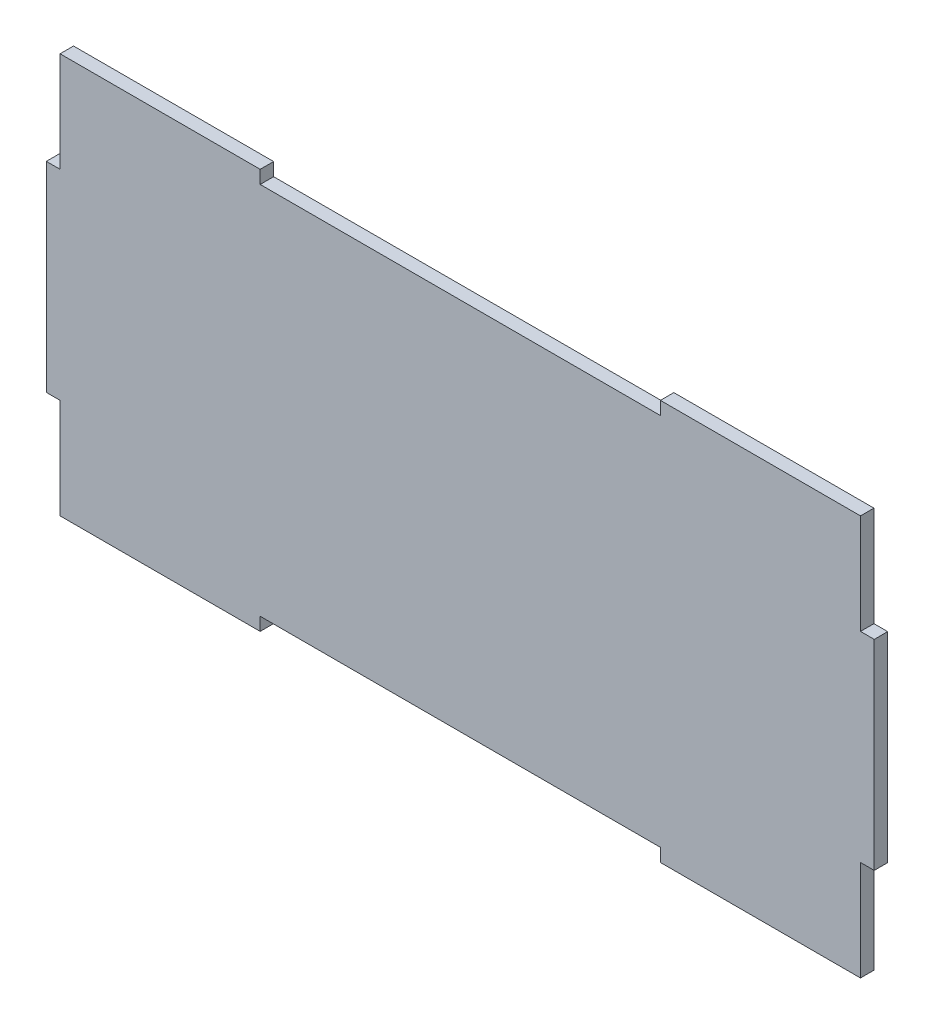
ISO-10303-21;
HEADER;
FILE_DESCRIPTION(('STEP AP214'),'2;1');
FILE_NAME('part.step','',(''),(''),'','','');
FILE_SCHEMA(('AUTOMOTIVE_DESIGN { 1 0 10303 214 1 1 1 1 }'));
ENDSEC;
DATA;
#1=APPLICATION_CONTEXT('core data for automotive mechanical design processes');
#2=APPLICATION_PROTOCOL_DEFINITION('international standard','automotive_design',2000,#1);
#3=PRODUCT_CONTEXT('',#1,'mechanical');
#4=PRODUCT('Part','Part','',(#3));
#5=PRODUCT_RELATED_PRODUCT_CATEGORY('part','',(#4));
#6=PRODUCT_DEFINITION_FORMATION('','',#4);
#7=PRODUCT_DEFINITION_CONTEXT('part definition',#1,'design');
#8=PRODUCT_DEFINITION('design','',#6,#7);
#9=PRODUCT_DEFINITION_SHAPE('','',#8);
#10=(LENGTH_UNIT() NAMED_UNIT(*) SI_UNIT(.MILLI.,.METRE.));
#11=(NAMED_UNIT(*) PLANE_ANGLE_UNIT() SI_UNIT($,.RADIAN.));
#12=(NAMED_UNIT(*) SI_UNIT($,.STERADIAN.) SOLID_ANGLE_UNIT());
#13=UNCERTAINTY_MEASURE_WITH_UNIT(LENGTH_MEASURE(1.E-05),#10,'distance_accuracy_value','');
#14=(GEOMETRIC_REPRESENTATION_CONTEXT(3) GLOBAL_UNCERTAINTY_ASSIGNED_CONTEXT((#13)) GLOBAL_UNIT_ASSIGNED_CONTEXT((#10,
#11,#12)) REPRESENTATION_CONTEXT('',''));
#15=CARTESIAN_POINT('',(0.,0.,0.));
#16=DIRECTION('',(0.,0.,1.));
#17=DIRECTION('',(1.,0.,0.));
#18=AXIS2_PLACEMENT_3D('',#15,#16,#17);
#19=CARTESIAN_POINT('',(-100.,-50.,3.36));
#20=DIRECTION('',(0.,1.,0.));
#21=DIRECTION('',(0.,0.,1.));
#22=AXIS2_PLACEMENT_3D('',#19,#20,#21);
#23=PLANE('',#22);
#24=DIRECTION('',(0.,0.,1.));
#25=VECTOR('',#24,1.);
#26=CARTESIAN_POINT('',(-50.,-50.,0.));
#27=LINE('',#26,#25);
#28=CARTESIAN_POINT('',(-50.,-50.,0.));
#29=VERTEX_POINT('',#28);
#30=CARTESIAN_POINT('',(-50.,-50.,3.36));
#31=VERTEX_POINT('',#30);
#32=EDGE_CURVE('E175',#29,#31,#27,.T.);
#33=ORIENTED_EDGE('',*,*,#32,.T.);
#34=DIRECTION('',(1.,0.,0.));
#35=VECTOR('',#34,1.);
#36=CARTESIAN_POINT('',(-100.,-50.,3.36));
#37=LINE('',#36,#35);
#38=CARTESIAN_POINT('',(-100.,-50.,3.36));
#39=VERTEX_POINT('',#38);
#40=EDGE_CURVE('E221',#39,#31,#37,.T.);
#41=ORIENTED_EDGE('',*,*,#40,.F.);
#42=DIRECTION('',(0.,0.,-1.));
#43=VECTOR('',#42,1.);
#44=CARTESIAN_POINT('',(-100.,-50.,3.36));
#45=LINE('',#44,#43);
#46=CARTESIAN_POINT('',(-100.,-50.,0.));
#47=VERTEX_POINT('',#46);
#48=EDGE_CURVE('E204',#39,#47,#45,.T.);
#49=ORIENTED_EDGE('',*,*,#48,.T.);
#50=DIRECTION('',(1.,0.,0.));
#51=VECTOR('',#50,1.);
#52=CARTESIAN_POINT('',(-100.,-50.,0.));
#53=LINE('',#52,#51);
#54=EDGE_CURVE('E196',#47,#29,#53,.T.);
#55=ORIENTED_EDGE('',*,*,#54,.T.);
#56=EDGE_LOOP('',(#33,#41,#49,#55));
#57=FACE_BOUND('',#56,.T.);
#58=ADVANCED_FACE('F38',(#57),#23,.F.);
#59=DIRECTION('',(0.,0.,1.));
#60=VECTOR('',#59,1.);
#61=CARTESIAN_POINT('',(50.,-50.,0.));
#62=LINE('',#61,#60);
#63=CARTESIAN_POINT('',(50.,-50.,0.));
#64=VERTEX_POINT('',#63);
#65=CARTESIAN_POINT('',(50.,-50.,3.36));
#66=VERTEX_POINT('',#65);
#67=EDGE_CURVE('E188',#64,#66,#62,.T.);
#68=ORIENTED_EDGE('',*,*,#67,.F.);
#69=CARTESIAN_POINT('',(100.,-50.,0.));
#70=VERTEX_POINT('',#69);
#71=EDGE_CURVE('E207',#64,#70,#53,.T.);
#72=ORIENTED_EDGE('',*,*,#71,.T.);
#73=DIRECTION('',(0.,0.,-1.));
#74=VECTOR('',#73,1.);
#75=CARTESIAN_POINT('',(100.,-50.,3.36));
#76=LINE('',#75,#74);
#77=CARTESIAN_POINT('',(100.,-50.,3.36));
#78=VERTEX_POINT('',#77);
#79=EDGE_CURVE('E217',#78,#70,#76,.T.);
#80=ORIENTED_EDGE('',*,*,#79,.F.);
#81=EDGE_CURVE('E263',#66,#78,#37,.T.);
#82=ORIENTED_EDGE('',*,*,#81,.F.);
#83=EDGE_LOOP('',(#68,#72,#80,#82));
#84=FACE_BOUND('',#83,.T.);
#85=ADVANCED_FACE('F396',(#84),#23,.F.);
#86=CARTESIAN_POINT('',(0.,0.,3.36));
#87=DIRECTION('',(0.,0.,1.));
#88=DIRECTION('',(1.,0.,0.));
#89=AXIS2_PLACEMENT_3D('',#86,#87,#88);
#90=PLANE('',#89);
#91=ORIENTED_EDGE('',*,*,#40,.T.);
#92=DIRECTION('',(0.,1.,0.));
#93=VECTOR('',#92,1.);
#94=CARTESIAN_POINT('',(-50.,-50.,3.36));
#95=LINE('',#94,#93);
#96=CARTESIAN_POINT('',(-50.,-46.72,3.36));
#97=VERTEX_POINT('',#96);
#98=EDGE_CURVE('E182',#31,#97,#95,.T.);
#99=ORIENTED_EDGE('',*,*,#98,.T.);
#100=DIRECTION('',(1.,0.,0.));
#101=VECTOR('',#100,1.);
#102=CARTESIAN_POINT('',(-50.,-46.72,3.36));
#103=LINE('',#102,#101);
#104=CARTESIAN_POINT('',(50.,-46.72,3.36));
#105=VERTEX_POINT('',#104);
#106=EDGE_CURVE('E200',#97,#105,#103,.T.);
#107=ORIENTED_EDGE('',*,*,#106,.T.);
#108=DIRECTION('',(0.,-1.,0.));
#109=VECTOR('',#108,1.);
#110=CARTESIAN_POINT('',(50.,-50.,3.36));
#111=LINE('',#110,#109);
#112=EDGE_CURVE('E382',#105,#66,#111,.T.);
#113=ORIENTED_EDGE('',*,*,#112,.T.);
#114=ORIENTED_EDGE('',*,*,#81,.T.);
#115=DIRECTION('',(0.,1.,0.));
#116=VECTOR('',#115,1.);
#117=CARTESIAN_POINT('',(100.,50.,3.36));
#118=LINE('',#117,#116);
#119=CARTESIAN_POINT('',(100.,-25.,3.36));
#120=VERTEX_POINT('',#119);
#121=EDGE_CURVE('E211',#78,#120,#118,.T.);
#122=ORIENTED_EDGE('',*,*,#121,.T.);
#123=DIRECTION('',(1.,0.,0.));
#124=VECTOR('',#123,1.);
#125=CARTESIAN_POINT('',(100.,-25.,3.36));
#126=LINE('',#125,#124);
#127=CARTESIAN_POINT('',(103.44,-25.,3.36));
#128=VERTEX_POINT('',#127);
#129=EDGE_CURVE('E312',#120,#128,#126,.T.);
#130=ORIENTED_EDGE('',*,*,#129,.T.);
#131=DIRECTION('',(0.,1.,0.));
#132=VECTOR('',#131,1.);
#133=CARTESIAN_POINT('',(103.44,25.,3.36));
#134=LINE('',#133,#132);
#135=CARTESIAN_POINT('',(103.44,25.,3.36));
#136=VERTEX_POINT('',#135);
#137=EDGE_CURVE('E336',#128,#136,#134,.T.);
#138=ORIENTED_EDGE('',*,*,#137,.T.);
#139=DIRECTION('',(-1.,0.,0.));
#140=VECTOR('',#139,1.);
#141=CARTESIAN_POINT('',(100.,25.,3.36));
#142=LINE('',#141,#140);
#143=CARTESIAN_POINT('',(100.,25.,3.36));
#144=VERTEX_POINT('',#143);
#145=EDGE_CURVE('E326',#136,#144,#142,.T.);
#146=ORIENTED_EDGE('',*,*,#145,.T.);
#147=CARTESIAN_POINT('',(100.,50.,3.36));
#148=VERTEX_POINT('',#147);
#149=EDGE_CURVE('E206',#144,#148,#118,.T.);
#150=ORIENTED_EDGE('',*,*,#149,.T.);
#151=DIRECTION('',(-1.,0.,0.));
#152=VECTOR('',#151,1.);
#153=CARTESIAN_POINT('',(-100.,50.,3.36));
#154=LINE('',#153,#152);
#155=CARTESIAN_POINT('',(50.,50.,3.36));
#156=VERTEX_POINT('',#155);
#157=EDGE_CURVE('E267',#148,#156,#154,.T.);
#158=ORIENTED_EDGE('',*,*,#157,.T.);
#159=DIRECTION('',(0.,1.,0.));
#160=VECTOR('',#159,1.);
#161=CARTESIAN_POINT('',(50.,50.,3.36));
#162=LINE('',#161,#160);
#163=CARTESIAN_POINT('',(50.,46.72,3.36));
#164=VERTEX_POINT('',#163);
#165=EDGE_CURVE('E352',#164,#156,#162,.T.);
#166=ORIENTED_EDGE('',*,*,#165,.F.);
#167=DIRECTION('',(1.,0.,0.));
#168=VECTOR('',#167,1.);
#169=CARTESIAN_POINT('',(-50.,46.72,3.36));
#170=LINE('',#169,#168);
#171=CARTESIAN_POINT('',(-50.,46.72,3.36));
#172=VERTEX_POINT('',#171);
#173=EDGE_CURVE('E356',#172,#164,#170,.T.);
#174=ORIENTED_EDGE('',*,*,#173,.F.);
#175=DIRECTION('',(0.,-1.,0.));
#176=VECTOR('',#175,1.);
#177=CARTESIAN_POINT('',(-50.,50.,3.36));
#178=LINE('',#177,#176);
#179=CARTESIAN_POINT('',(-50.,50.,3.36));
#180=VERTEX_POINT('',#179);
#181=EDGE_CURVE('E360',#180,#172,#178,.T.);
#182=ORIENTED_EDGE('',*,*,#181,.F.);
#183=CARTESIAN_POINT('',(-100.,50.,3.36));
#184=VERTEX_POINT('',#183);
#185=EDGE_CURVE('E270',#180,#184,#154,.T.);
#186=ORIENTED_EDGE('',*,*,#185,.T.);
#187=DIRECTION('',(0.,-1.,0.));
#188=VECTOR('',#187,1.);
#189=CARTESIAN_POINT('',(-100.,50.,3.36));
#190=LINE('',#189,#188);
#191=CARTESIAN_POINT('',(-100.,25.,3.36));
#192=VERTEX_POINT('',#191);
#193=EDGE_CURVE('E233',#184,#192,#190,.T.);
#194=ORIENTED_EDGE('',*,*,#193,.T.);
#195=DIRECTION('',(1.,0.,0.));
#196=VECTOR('',#195,1.);
#197=CARTESIAN_POINT('',(-100.,25.,3.36));
#198=LINE('',#197,#196);
#199=CARTESIAN_POINT('',(-103.44,25.,3.36));
#200=VERTEX_POINT('',#199);
#201=EDGE_CURVE('E278',#200,#192,#198,.T.);
#202=ORIENTED_EDGE('',*,*,#201,.F.);
#203=DIRECTION('',(0.,1.,0.));
#204=VECTOR('',#203,1.);
#205=CARTESIAN_POINT('',(-103.44,25.,3.36));
#206=LINE('',#205,#204);
#207=CARTESIAN_POINT('',(-103.44,-25.,3.36));
#208=VERTEX_POINT('',#207);
#209=EDGE_CURVE('E300',#208,#200,#206,.T.);
#210=ORIENTED_EDGE('',*,*,#209,.F.);
#211=DIRECTION('',(-1.,0.,0.));
#212=VECTOR('',#211,1.);
#213=CARTESIAN_POINT('',(-100.,-25.,3.36));
#214=LINE('',#213,#212);
#215=CARTESIAN_POINT('',(-100.,-25.,3.36));
#216=VERTEX_POINT('',#215);
#217=EDGE_CURVE('E289',#216,#208,#214,.T.);
#218=ORIENTED_EDGE('',*,*,#217,.F.);
#219=EDGE_CURVE('E266',#216,#39,#190,.T.);
#220=ORIENTED_EDGE('',*,*,#219,.T.);
#221=EDGE_LOOP('',(#91,#99,#107,#113,#114,#122,#130,#138,#146,#150,#158,#166,#174,#182,#186,
#194,#202,#210,#218,#220));
#222=FACE_BOUND('',#221,.T.);
#223=ADVANCED_FACE('F405',(#222),#90,.T.);
#224=CARTESIAN_POINT('',(0.,0.,0.));
#225=DIRECTION('',(0.,0.,1.));
#226=DIRECTION('',(1.,0.,0.));
#227=AXIS2_PLACEMENT_3D('',#224,#225,#226);
#228=PLANE('',#227);
#229=DIRECTION('',(0.,1.,0.));
#230=VECTOR('',#229,1.);
#231=CARTESIAN_POINT('',(-50.,-50.,0.));
#232=LINE('',#231,#230);
#233=CARTESIAN_POINT('',(-50.,-46.72,0.));
#234=VERTEX_POINT('',#233);
#235=EDGE_CURVE('E179',#29,#234,#232,.T.);
#236=ORIENTED_EDGE('',*,*,#235,.F.);
#237=ORIENTED_EDGE('',*,*,#54,.F.);
#238=DIRECTION('',(0.,-1.,0.));
#239=VECTOR('',#238,1.);
#240=CARTESIAN_POINT('',(-100.,50.,0.));
#241=LINE('',#240,#239);
#242=CARTESIAN_POINT('',(-100.,-25.,0.));
#243=VERTEX_POINT('',#242);
#244=EDGE_CURVE('E244',#243,#47,#241,.T.);
#245=ORIENTED_EDGE('',*,*,#244,.F.);
#246=DIRECTION('',(-1.,0.,0.));
#247=VECTOR('',#246,1.);
#248=CARTESIAN_POINT('',(-100.,-25.,0.));
#249=LINE('',#248,#247);
#250=CARTESIAN_POINT('',(-103.44,-25.,0.));
#251=VERTEX_POINT('',#250);
#252=EDGE_CURVE('E293',#243,#251,#249,.T.);
#253=ORIENTED_EDGE('',*,*,#252,.T.);
#254=DIRECTION('',(0.,1.,0.));
#255=VECTOR('',#254,1.);
#256=CARTESIAN_POINT('',(-103.44,25.,0.));
#257=LINE('',#256,#255);
#258=CARTESIAN_POINT('',(-103.44,25.,0.));
#259=VERTEX_POINT('',#258);
#260=EDGE_CURVE('E290',#251,#259,#257,.T.);
#261=ORIENTED_EDGE('',*,*,#260,.T.);
#262=DIRECTION('',(1.,0.,0.));
#263=VECTOR('',#262,1.);
#264=CARTESIAN_POINT('',(-100.,25.,0.));
#265=LINE('',#264,#263);
#266=CARTESIAN_POINT('',(-100.,25.,0.));
#267=VERTEX_POINT('',#266);
#268=EDGE_CURVE('E242',#259,#267,#265,.T.);
#269=ORIENTED_EDGE('',*,*,#268,.T.);
#270=CARTESIAN_POINT('',(-100.,50.,0.));
#271=VERTEX_POINT('',#270);
#272=EDGE_CURVE('E213',#271,#267,#241,.T.);
#273=ORIENTED_EDGE('',*,*,#272,.F.);
#274=DIRECTION('',(-1.,0.,0.));
#275=VECTOR('',#274,1.);
#276=CARTESIAN_POINT('',(-100.,50.,0.));
#277=LINE('',#276,#275);
#278=CARTESIAN_POINT('',(-50.,50.,0.));
#279=VERTEX_POINT('',#278);
#280=EDGE_CURVE('E239',#279,#271,#277,.T.);
#281=ORIENTED_EDGE('',*,*,#280,.F.);
#282=DIRECTION('',(0.,-1.,0.));
#283=VECTOR('',#282,1.);
#284=CARTESIAN_POINT('',(-50.,50.,0.));
#285=LINE('',#284,#283);
#286=CARTESIAN_POINT('',(-50.,46.72,0.));
#287=VERTEX_POINT('',#286);
#288=EDGE_CURVE('E355',#279,#287,#285,.T.);
#289=ORIENTED_EDGE('',*,*,#288,.T.);
#290=DIRECTION('',(1.,0.,0.));
#291=VECTOR('',#290,1.);
#292=CARTESIAN_POINT('',(-50.,46.72,0.));
#293=LINE('',#292,#291);
#294=CARTESIAN_POINT('',(50.,46.72,0.));
#295=VERTEX_POINT('',#294);
#296=EDGE_CURVE('E367',#287,#295,#293,.T.);
#297=ORIENTED_EDGE('',*,*,#296,.T.);
#298=DIRECTION('',(0.,1.,0.));
#299=VECTOR('',#298,1.);
#300=CARTESIAN_POINT('',(50.,50.,0.));
#301=LINE('',#300,#299);
#302=CARTESIAN_POINT('',(50.,50.,0.));
#303=VERTEX_POINT('',#302);
#304=EDGE_CURVE('E62',#295,#303,#301,.T.);
#305=ORIENTED_EDGE('',*,*,#304,.T.);
#306=CARTESIAN_POINT('',(100.,50.,0.));
#307=VERTEX_POINT('',#306);
#308=EDGE_CURVE('E246',#307,#303,#277,.T.);
#309=ORIENTED_EDGE('',*,*,#308,.F.);
#310=DIRECTION('',(0.,1.,0.));
#311=VECTOR('',#310,1.);
#312=CARTESIAN_POINT('',(100.,50.,0.));
#313=LINE('',#312,#311);
#314=CARTESIAN_POINT('',(100.,25.,0.));
#315=VERTEX_POINT('',#314);
#316=EDGE_CURVE('E260',#315,#307,#313,.T.);
#317=ORIENTED_EDGE('',*,*,#316,.F.);
#318=DIRECTION('',(-1.,0.,0.));
#319=VECTOR('',#318,1.);
#320=CARTESIAN_POINT('',(100.,25.,0.));
#321=LINE('',#320,#319);
#322=CARTESIAN_POINT('',(103.44,25.,0.));
#323=VERTEX_POINT('',#322);
#324=EDGE_CURVE('E330',#323,#315,#321,.T.);
#325=ORIENTED_EDGE('',*,*,#324,.F.);
#326=DIRECTION('',(0.,1.,0.));
#327=VECTOR('',#326,1.);
#328=CARTESIAN_POINT('',(103.44,25.,0.));
#329=LINE('',#328,#327);
#330=CARTESIAN_POINT('',(103.44,-25.,0.));
#331=VERTEX_POINT('',#330);
#332=EDGE_CURVE('E327',#331,#323,#329,.T.);
#333=ORIENTED_EDGE('',*,*,#332,.F.);
#334=DIRECTION('',(1.,0.,0.));
#335=VECTOR('',#334,1.);
#336=CARTESIAN_POINT('',(100.,-25.,0.));
#337=LINE('',#336,#335);
#338=CARTESIAN_POINT('',(100.,-25.,0.));
#339=VERTEX_POINT('',#338);
#340=EDGE_CURVE('E323',#339,#331,#337,.T.);
#341=ORIENTED_EDGE('',*,*,#340,.F.);
#342=EDGE_CURVE('E255',#70,#339,#313,.T.);
#343=ORIENTED_EDGE('',*,*,#342,.F.);
#344=ORIENTED_EDGE('',*,*,#71,.F.);
#345=DIRECTION('',(0.,-1.,0.));
#346=VECTOR('',#345,1.);
#347=CARTESIAN_POINT('',(50.,-50.,0.));
#348=LINE('',#347,#346);
#349=CARTESIAN_POINT('',(50.,-46.72,0.));
#350=VERTEX_POINT('',#349);
#351=EDGE_CURVE('E199',#350,#64,#348,.T.);
#352=ORIENTED_EDGE('',*,*,#351,.F.);
#353=DIRECTION('',(1.,0.,0.));
#354=VECTOR('',#353,1.);
#355=CARTESIAN_POINT('',(-50.,-46.72,0.));
#356=LINE('',#355,#354);
#357=EDGE_CURVE('E189',#234,#350,#356,.T.);
#358=ORIENTED_EDGE('',*,*,#357,.F.);
#359=EDGE_LOOP('',(#236,#237,#245,#253,#261,#269,#273,#281,#289,#297,#305,#309,#317,#325,#333,
#341,#343,#344,#352,#358));
#360=FACE_BOUND('',#359,.T.);
#361=ADVANCED_FACE('F194',(#360),#228,.F.);
#362=CARTESIAN_POINT('',(-100.,50.,3.36));
#363=DIRECTION('',(0.,-1.,0.));
#364=DIRECTION('',(0.,0.,-1.));
#365=AXIS2_PLACEMENT_3D('',#362,#363,#364);
#366=PLANE('',#365);
#367=ORIENTED_EDGE('',*,*,#185,.F.);
#368=DIRECTION('',(0.,0.,1.));
#369=VECTOR('',#368,1.);
#370=CARTESIAN_POINT('',(-50.,50.,0.));
#371=LINE('',#370,#369);
#372=EDGE_CURVE('E333',#279,#180,#371,.T.);
#373=ORIENTED_EDGE('',*,*,#372,.F.);
#374=ORIENTED_EDGE('',*,*,#280,.T.);
#375=DIRECTION('',(0.,0.,-1.));
#376=VECTOR('',#375,1.);
#377=CARTESIAN_POINT('',(-100.,50.,3.36));
#378=LINE('',#377,#376);
#379=EDGE_CURVE('E47',#184,#271,#378,.T.);
#380=ORIENTED_EDGE('',*,*,#379,.F.);
#381=EDGE_LOOP('',(#367,#373,#374,#380));
#382=FACE_BOUND('',#381,.T.);
#383=ADVANCED_FACE('F414',(#382),#366,.F.);
#384=CARTESIAN_POINT('',(100.,50.,3.36));
#385=DIRECTION('',(-1.,0.,0.));
#386=DIRECTION('',(0.,-1.,0.));
#387=AXIS2_PLACEMENT_3D('',#384,#385,#386);
#388=PLANE('',#387);
#389=DIRECTION('',(0.,0.,-1.));
#390=VECTOR('',#389,1.);
#391=CARTESIAN_POINT('',(100.,-25.,3.36));
#392=LINE('',#391,#390);
#393=EDGE_CURVE('E297',#120,#339,#392,.T.);
#394=ORIENTED_EDGE('',*,*,#393,.F.);
#395=ORIENTED_EDGE('',*,*,#121,.F.);
#396=ORIENTED_EDGE('',*,*,#79,.T.);
#397=ORIENTED_EDGE('',*,*,#342,.T.);
#398=EDGE_LOOP('',(#394,#395,#396,#397));
#399=FACE_BOUND('',#398,.T.);
#400=ADVANCED_FACE('F402',(#399),#388,.F.);
#401=CARTESIAN_POINT('',(-100.,50.,3.36));
#402=DIRECTION('',(1.,0.,0.));
#403=DIRECTION('',(0.,1.,0.));
#404=AXIS2_PLACEMENT_3D('',#401,#402,#403);
#405=PLANE('',#404);
#406=DIRECTION('',(0.,0.,-1.));
#407=VECTOR('',#406,1.);
#408=CARTESIAN_POINT('',(-100.,25.,3.36));
#409=LINE('',#408,#407);
#410=EDGE_CURVE('E284',#192,#267,#409,.T.);
#411=ORIENTED_EDGE('',*,*,#410,.F.);
#412=ORIENTED_EDGE('',*,*,#193,.F.);
#413=ORIENTED_EDGE('',*,*,#379,.T.);
#414=ORIENTED_EDGE('',*,*,#272,.T.);
#415=EDGE_LOOP('',(#411,#412,#413,#414));
#416=FACE_BOUND('',#415,.T.);
#417=ADVANCED_FACE('F231',(#416),#405,.F.);
#418=ORIENTED_EDGE('',*,*,#149,.F.);
#419=DIRECTION('',(0.,0.,-1.));
#420=VECTOR('',#419,1.);
#421=CARTESIAN_POINT('',(100.,25.,3.36));
#422=LINE('',#421,#420);
#423=EDGE_CURVE('E307',#144,#315,#422,.T.);
#424=ORIENTED_EDGE('',*,*,#423,.T.);
#425=ORIENTED_EDGE('',*,*,#316,.T.);
#426=DIRECTION('',(0.,0.,-1.));
#427=VECTOR('',#426,1.);
#428=CARTESIAN_POINT('',(100.,50.,3.36));
#429=LINE('',#428,#427);
#430=EDGE_CURVE('E11',#148,#307,#429,.T.);
#431=ORIENTED_EDGE('',*,*,#430,.F.);
#432=EDGE_LOOP('',(#418,#424,#425,#431));
#433=FACE_BOUND('',#432,.T.);
#434=ADVANCED_FACE('F40',(#433),#388,.F.);
#435=ORIENTED_EDGE('',*,*,#308,.T.);
#436=DIRECTION('',(0.,0.,1.));
#437=VECTOR('',#436,1.);
#438=CARTESIAN_POINT('',(50.,50.,0.));
#439=LINE('',#438,#437);
#440=EDGE_CURVE('E347',#303,#156,#439,.T.);
#441=ORIENTED_EDGE('',*,*,#440,.T.);
#442=ORIENTED_EDGE('',*,*,#157,.F.);
#443=ORIENTED_EDGE('',*,*,#430,.T.);
#444=EDGE_LOOP('',(#435,#441,#442,#443));
#445=FACE_BOUND('',#444,.T.);
#446=ADVANCED_FACE('F423',(#445),#366,.F.);
#447=ORIENTED_EDGE('',*,*,#219,.F.);
#448=DIRECTION('',(0.,0.,-1.));
#449=VECTOR('',#448,1.);
#450=CARTESIAN_POINT('',(-100.,-25.,3.36));
#451=LINE('',#450,#449);
#452=EDGE_CURVE('E274',#216,#243,#451,.T.);
#453=ORIENTED_EDGE('',*,*,#452,.T.);
#454=ORIENTED_EDGE('',*,*,#244,.T.);
#455=ORIENTED_EDGE('',*,*,#48,.F.);
#456=EDGE_LOOP('',(#447,#453,#454,#455));
#457=FACE_BOUND('',#456,.T.);
#458=ADVANCED_FACE('F460',(#457),#405,.F.);
#459=CARTESIAN_POINT('',(-100.,25.,3.36));
#460=DIRECTION('',(0.,1.,0.));
#461=DIRECTION('',(0.,0.,1.));
#462=AXIS2_PLACEMENT_3D('',#459,#460,#461);
#463=PLANE('',#462);
#464=ORIENTED_EDGE('',*,*,#268,.F.);
#465=DIRECTION('',(0.,0.,-1.));
#466=VECTOR('',#465,1.);
#467=CARTESIAN_POINT('',(-103.44,25.,3.36));
#468=LINE('',#467,#466);
#469=EDGE_CURVE('E281',#200,#259,#468,.T.);
#470=ORIENTED_EDGE('',*,*,#469,.F.);
#471=ORIENTED_EDGE('',*,*,#201,.T.);
#472=ORIENTED_EDGE('',*,*,#410,.T.);
#473=EDGE_LOOP('',(#464,#470,#471,#472));
#474=FACE_BOUND('',#473,.T.);
#475=ADVANCED_FACE('F462',(#474),#463,.T.);
#476=CARTESIAN_POINT('',(-103.44,25.,3.36));
#477=DIRECTION('',(-1.,0.,0.));
#478=DIRECTION('',(0.,0.,1.));
#479=AXIS2_PLACEMENT_3D('',#476,#477,#478);
#480=PLANE('',#479);
#481=ORIENTED_EDGE('',*,*,#260,.F.);
#482=DIRECTION('',(0.,0.,-1.));
#483=VECTOR('',#482,1.);
#484=CARTESIAN_POINT('',(-103.44,-25.,3.36));
#485=LINE('',#484,#483);
#486=EDGE_CURVE('E277',#208,#251,#485,.T.);
#487=ORIENTED_EDGE('',*,*,#486,.F.);
#488=ORIENTED_EDGE('',*,*,#209,.T.);
#489=ORIENTED_EDGE('',*,*,#469,.T.);
#490=EDGE_LOOP('',(#481,#487,#488,#489));
#491=FACE_BOUND('',#490,.T.);
#492=ADVANCED_FACE('F448',(#491),#480,.T.);
#493=CARTESIAN_POINT('',(-100.,-25.,3.36));
#494=DIRECTION('',(0.,-1.,0.));
#495=DIRECTION('',(1.,0.,0.));
#496=AXIS2_PLACEMENT_3D('',#493,#494,#495);
#497=PLANE('',#496);
#498=ORIENTED_EDGE('',*,*,#252,.F.);
#499=ORIENTED_EDGE('',*,*,#452,.F.);
#500=ORIENTED_EDGE('',*,*,#217,.T.);
#501=ORIENTED_EDGE('',*,*,#486,.T.);
#502=EDGE_LOOP('',(#498,#499,#500,#501));
#503=FACE_BOUND('',#502,.T.);
#504=ADVANCED_FACE('F441',(#503),#497,.T.);
#505=CARTESIAN_POINT('',(100.,-25.,3.36));
#506=DIRECTION('',(0.,1.,0.));
#507=DIRECTION('',(-1.,0.,0.));
#508=AXIS2_PLACEMENT_3D('',#505,#506,#507);
#509=PLANE('',#508);
#510=ORIENTED_EDGE('',*,*,#340,.T.);
#511=DIRECTION('',(0.,0.,-1.));
#512=VECTOR('',#511,1.);
#513=CARTESIAN_POINT('',(103.44,-25.,3.36));
#514=LINE('',#513,#512);
#515=EDGE_CURVE('E316',#128,#331,#514,.T.);
#516=ORIENTED_EDGE('',*,*,#515,.F.);
#517=ORIENTED_EDGE('',*,*,#129,.F.);
#518=ORIENTED_EDGE('',*,*,#393,.T.);
#519=EDGE_LOOP('',(#510,#516,#517,#518));
#520=FACE_BOUND('',#519,.T.);
#521=ADVANCED_FACE('F439',(#520),#509,.F.);
#522=CARTESIAN_POINT('',(103.44,25.,3.36));
#523=DIRECTION('',(-1.,0.,0.));
#524=DIRECTION('',(0.,0.,1.));
#525=AXIS2_PLACEMENT_3D('',#522,#523,#524);
#526=PLANE('',#525);
#527=ORIENTED_EDGE('',*,*,#332,.T.);
#528=DIRECTION('',(0.,0.,-1.));
#529=VECTOR('',#528,1.);
#530=CARTESIAN_POINT('',(103.44,25.,3.36));
#531=LINE('',#530,#529);
#532=EDGE_CURVE('E311',#136,#323,#531,.T.);
#533=ORIENTED_EDGE('',*,*,#532,.F.);
#534=ORIENTED_EDGE('',*,*,#137,.F.);
#535=ORIENTED_EDGE('',*,*,#515,.T.);
#536=EDGE_LOOP('',(#527,#533,#534,#535));
#537=FACE_BOUND('',#536,.T.);
#538=ADVANCED_FACE('F437',(#537),#526,.F.);
#539=CARTESIAN_POINT('',(100.,25.,3.36));
#540=DIRECTION('',(0.,-1.,0.));
#541=DIRECTION('',(0.,0.,-1.));
#542=AXIS2_PLACEMENT_3D('',#539,#540,#541);
#543=PLANE('',#542);
#544=ORIENTED_EDGE('',*,*,#324,.T.);
#545=ORIENTED_EDGE('',*,*,#423,.F.);
#546=ORIENTED_EDGE('',*,*,#145,.F.);
#547=ORIENTED_EDGE('',*,*,#532,.T.);
#548=EDGE_LOOP('',(#544,#545,#546,#547));
#549=FACE_BOUND('',#548,.T.);
#550=ADVANCED_FACE('F433',(#549),#543,.F.);
#551=CARTESIAN_POINT('',(-50.,50.,0.));
#552=DIRECTION('',(-1.,0.,0.));
#553=DIRECTION('',(0.,0.,1.));
#554=AXIS2_PLACEMENT_3D('',#551,#552,#553);
#555=PLANE('',#554);
#556=ORIENTED_EDGE('',*,*,#181,.T.);
#557=DIRECTION('',(0.,0.,1.));
#558=VECTOR('',#557,1.);
#559=CARTESIAN_POINT('',(-50.,46.72,0.));
#560=LINE('',#559,#558);
#561=EDGE_CURVE('E341',#287,#172,#560,.T.);
#562=ORIENTED_EDGE('',*,*,#561,.F.);
#563=ORIENTED_EDGE('',*,*,#288,.F.);
#564=ORIENTED_EDGE('',*,*,#372,.T.);
#565=EDGE_LOOP('',(#556,#562,#563,#564));
#566=FACE_BOUND('',#565,.T.);
#567=ADVANCED_FACE('F416',(#566),#555,.F.);
#568=CARTESIAN_POINT('',(50.,50.,0.));
#569=DIRECTION('',(1.,0.,0.));
#570=DIRECTION('',(0.,1.,0.));
#571=AXIS2_PLACEMENT_3D('',#568,#569,#570);
#572=PLANE('',#571);
#573=ORIENTED_EDGE('',*,*,#165,.T.);
#574=ORIENTED_EDGE('',*,*,#440,.F.);
#575=ORIENTED_EDGE('',*,*,#304,.F.);
#576=DIRECTION('',(0.,0.,1.));
#577=VECTOR('',#576,1.);
#578=CARTESIAN_POINT('',(50.,46.72,0.));
#579=LINE('',#578,#577);
#580=EDGE_CURVE('E344',#295,#164,#579,.T.);
#581=ORIENTED_EDGE('',*,*,#580,.T.);
#582=EDGE_LOOP('',(#573,#574,#575,#581));
#583=FACE_BOUND('',#582,.T.);
#584=ADVANCED_FACE('F421',(#583),#572,.F.);
#585=CARTESIAN_POINT('',(-50.,46.72,0.));
#586=DIRECTION('',(0.,-1.,0.));
#587=DIRECTION('',(1.,0.,0.));
#588=AXIS2_PLACEMENT_3D('',#585,#586,#587);
#589=PLANE('',#588);
#590=ORIENTED_EDGE('',*,*,#173,.T.);
#591=ORIENTED_EDGE('',*,*,#580,.F.);
#592=ORIENTED_EDGE('',*,*,#296,.F.);
#593=ORIENTED_EDGE('',*,*,#561,.T.);
#594=EDGE_LOOP('',(#590,#591,#592,#593));
#595=FACE_BOUND('',#594,.T.);
#596=ADVANCED_FACE('F419',(#595),#589,.F.);
#597=CARTESIAN_POINT('',(-50.,-50.,0.));
#598=DIRECTION('',(1.,0.,0.));
#599=DIRECTION('',(0.,0.,-1.));
#600=AXIS2_PLACEMENT_3D('',#597,#598,#599);
#601=PLANE('',#600);
#602=ORIENTED_EDGE('',*,*,#98,.F.);
#603=ORIENTED_EDGE('',*,*,#32,.F.);
#604=ORIENTED_EDGE('',*,*,#235,.T.);
#605=DIRECTION('',(0.,0.,1.));
#606=VECTOR('',#605,1.);
#607=CARTESIAN_POINT('',(-50.,-46.72,0.));
#608=LINE('',#607,#606);
#609=EDGE_CURVE('E364',#234,#97,#608,.T.);
#610=ORIENTED_EDGE('',*,*,#609,.T.);
#611=EDGE_LOOP('',(#602,#603,#604,#610));
#612=FACE_BOUND('',#611,.T.);
#613=ADVANCED_FACE('F177',(#612),#601,.T.);
#614=CARTESIAN_POINT('',(-50.,-46.72,0.));
#615=DIRECTION('',(0.,-1.,0.));
#616=DIRECTION('',(1.,0.,0.));
#617=AXIS2_PLACEMENT_3D('',#614,#615,#616);
#618=PLANE('',#617);
#619=ORIENTED_EDGE('',*,*,#106,.F.);
#620=ORIENTED_EDGE('',*,*,#609,.F.);
#621=ORIENTED_EDGE('',*,*,#357,.T.);
#622=DIRECTION('',(0.,0.,1.));
#623=VECTOR('',#622,1.);
#624=CARTESIAN_POINT('',(50.,-46.72,0.));
#625=LINE('',#624,#623);
#626=EDGE_CURVE('E54',#350,#105,#625,.T.);
#627=ORIENTED_EDGE('',*,*,#626,.T.);
#628=EDGE_LOOP('',(#619,#620,#621,#627));
#629=FACE_BOUND('',#628,.T.);
#630=ADVANCED_FACE('F497',(#629),#618,.T.);
#631=CARTESIAN_POINT('',(50.,-50.,0.));
#632=DIRECTION('',(-1.,0.,0.));
#633=DIRECTION('',(0.,-1.,0.));
#634=AXIS2_PLACEMENT_3D('',#631,#632,#633);
#635=PLANE('',#634);
#636=ORIENTED_EDGE('',*,*,#112,.F.);
#637=ORIENTED_EDGE('',*,*,#626,.F.);
#638=ORIENTED_EDGE('',*,*,#351,.T.);
#639=ORIENTED_EDGE('',*,*,#67,.T.);
#640=EDGE_LOOP('',(#636,#637,#638,#639));
#641=FACE_BOUND('',#640,.T.);
#642=ADVANCED_FACE('F392',(#641),#635,.T.);
#643=CLOSED_SHELL('',(#58,#85,#223,#361,#383,#400,#417,#434,#446,#458,#475,#492,#504,#521,#538,
#550,#567,#584,#596,#613,#630,#642));
#644=MANIFOLD_SOLID_BREP('B2',#643);
#645=ADVANCED_BREP_SHAPE_REPRESENTATION('',(#18,#644),#14);
#646=SHAPE_DEFINITION_REPRESENTATION(#9,#645);
ENDSEC;
END-ISO-10303-21;
